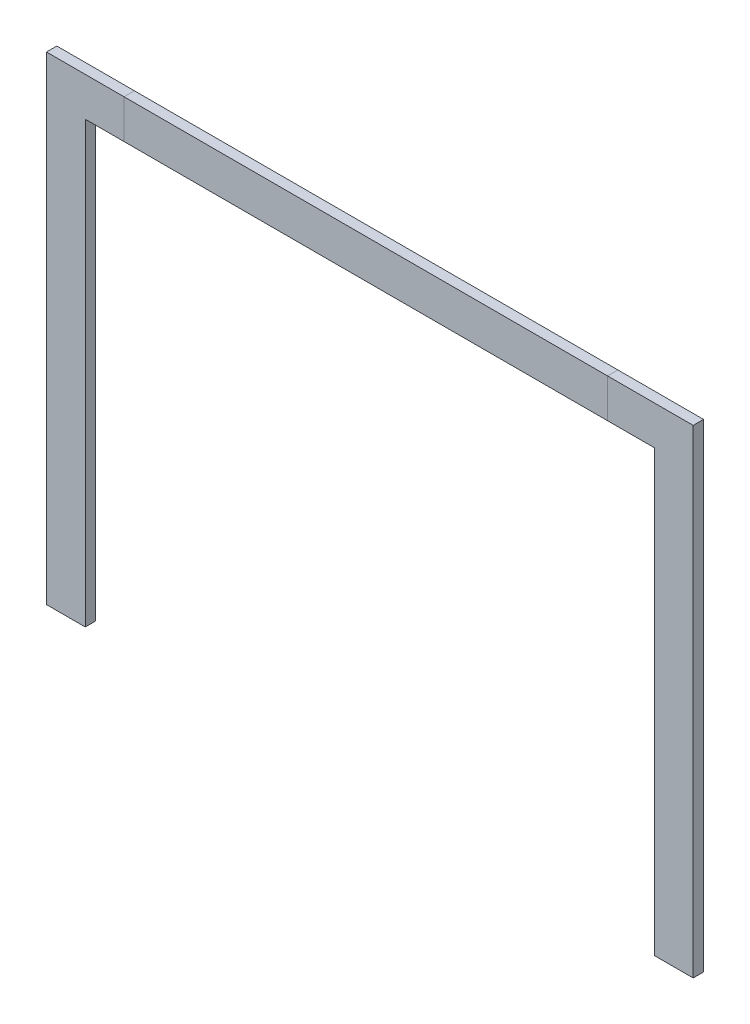
ISO-10303-21;
HEADER;
FILE_DESCRIPTION(('STEP AP214'),'2;1');
FILE_NAME('part.step','',(''),(''),'','','');
FILE_SCHEMA(('AUTOMOTIVE_DESIGN { 1 0 10303 214 1 1 1 1 }'));
ENDSEC;
DATA;
#1=APPLICATION_CONTEXT('core data for automotive mechanical design processes');
#2=APPLICATION_PROTOCOL_DEFINITION('international standard','automotive_design',2000,#1);
#3=PRODUCT_CONTEXT('',#1,'mechanical');
#4=PRODUCT('Part','Part','',(#3));
#5=PRODUCT_RELATED_PRODUCT_CATEGORY('part','',(#4));
#6=PRODUCT_DEFINITION_FORMATION('','',#4);
#7=PRODUCT_DEFINITION_CONTEXT('part definition',#1,'design');
#8=PRODUCT_DEFINITION('design','',#6,#7);
#9=PRODUCT_DEFINITION_SHAPE('','',#8);
#10=(LENGTH_UNIT() NAMED_UNIT(*) SI_UNIT(.MILLI.,.METRE.));
#11=(NAMED_UNIT(*) PLANE_ANGLE_UNIT() SI_UNIT($,.RADIAN.));
#12=(NAMED_UNIT(*) SI_UNIT($,.STERADIAN.) SOLID_ANGLE_UNIT());
#13=UNCERTAINTY_MEASURE_WITH_UNIT(LENGTH_MEASURE(1.E-05),#10,'distance_accuracy_value','');
#14=(GEOMETRIC_REPRESENTATION_CONTEXT(3) GLOBAL_UNCERTAINTY_ASSIGNED_CONTEXT((#13)) GLOBAL_UNIT_ASSIGNED_CONTEXT((#10,
#11,#12)) REPRESENTATION_CONTEXT('',''));
#15=CARTESIAN_POINT('',(0.,0.,0.));
#16=DIRECTION('',(0.,0.,1.));
#17=DIRECTION('',(1.,0.,0.));
#18=AXIS2_PLACEMENT_3D('',#15,#16,#17);
#19=CARTESIAN_POINT('',(-125.,-92.5,4.));
#20=DIRECTION('',(0.,1.,0.));
#21=DIRECTION('',(0.,0.,1.));
#22=AXIS2_PLACEMENT_3D('',#19,#20,#21);
#23=PLANE('',#22);
#24=DIRECTION('',(1.,0.,0.));
#25=VECTOR('',#24,1.);
#26=CARTESIAN_POINT('',(-125.,-92.5,0.));
#27=LINE('',#26,#25);
#28=CARTESIAN_POINT('',(-125.,-92.5,0.));
#29=VERTEX_POINT('',#28);
#30=CARTESIAN_POINT('',(-110.,-92.5,0.));
#31=VERTEX_POINT('',#30);
#32=EDGE_CURVE('E127',#29,#31,#27,.T.);
#33=ORIENTED_EDGE('',*,*,#32,.T.);
#34=DIRECTION('',(0.,0.,1.));
#35=VECTOR('',#34,1.);
#36=CARTESIAN_POINT('',(-110.,-92.5,0.));
#37=LINE('',#36,#35);
#38=CARTESIAN_POINT('',(-110.,-92.5,4.));
#39=VERTEX_POINT('',#38);
#40=EDGE_CURVE('E61',#31,#39,#37,.T.);
#41=ORIENTED_EDGE('',*,*,#40,.T.);
#42=DIRECTION('',(1.,0.,0.));
#43=VECTOR('',#42,1.);
#44=CARTESIAN_POINT('',(-125.,-92.5,4.));
#45=LINE('',#44,#43);
#46=CARTESIAN_POINT('',(-125.,-92.5,4.));
#47=VERTEX_POINT('',#46);
#48=EDGE_CURVE('E137',#47,#39,#45,.T.);
#49=ORIENTED_EDGE('',*,*,#48,.F.);
#50=DIRECTION('',(0.,0.,-1.));
#51=VECTOR('',#50,1.);
#52=CARTESIAN_POINT('',(-125.,-92.5,4.));
#53=LINE('',#52,#51);
#54=EDGE_CURVE('E131',#47,#29,#53,.T.);
#55=ORIENTED_EDGE('',*,*,#54,.T.);
#56=EDGE_LOOP('',(#33,#41,#49,#55));
#57=FACE_BOUND('',#56,.T.);
#58=ADVANCED_FACE('F44',(#57),#23,.F.);
#59=CARTESIAN_POINT('',(0.,0.,4.));
#60=DIRECTION('',(0.,0.,-1.));
#61=DIRECTION('',(-1.,0.,0.));
#62=AXIS2_PLACEMENT_3D('',#59,#60,#61);
#63=PLANE('',#62);
#64=ORIENTED_EDGE('',*,*,#48,.T.);
#65=DIRECTION('',(0.,-1.,0.));
#66=VECTOR('',#65,1.);
#67=CARTESIAN_POINT('',(-110.,-92.5,4.));
#68=LINE('',#67,#66);
#69=CARTESIAN_POINT('',(-110.,77.5,4.));
#70=VERTEX_POINT('',#69);
#71=EDGE_CURVE('E53',#70,#39,#68,.T.);
#72=ORIENTED_EDGE('',*,*,#71,.F.);
#73=DIRECTION('',(-1.,0.,0.));
#74=VECTOR('',#73,1.);
#75=CARTESIAN_POINT('',(-110.,77.5,4.));
#76=LINE('',#75,#74);
#77=CARTESIAN_POINT('',(-95.,77.5,4.));
#78=VERTEX_POINT('',#77);
#79=EDGE_CURVE('E48',#78,#70,#76,.T.);
#80=ORIENTED_EDGE('',*,*,#79,.F.);
#81=DIRECTION('',(0.,1.,0.));
#82=VECTOR('',#81,1.);
#83=CARTESIAN_POINT('',(-95.,0.,4.));
#84=LINE('',#83,#82);
#85=CARTESIAN_POINT('',(-95.,92.5,4.));
#86=VERTEX_POINT('',#85);
#87=EDGE_CURVE('E135',#78,#86,#84,.T.);
#88=ORIENTED_EDGE('',*,*,#87,.T.);
#89=DIRECTION('',(-1.,0.,0.));
#90=VECTOR('',#89,1.);
#91=CARTESIAN_POINT('',(-125.,92.5,4.));
#92=LINE('',#91,#90);
#93=CARTESIAN_POINT('',(-125.,92.5,4.));
#94=VERTEX_POINT('',#93);
#95=EDGE_CURVE('E134',#86,#94,#92,.T.);
#96=ORIENTED_EDGE('',*,*,#95,.T.);
#97=DIRECTION('',(0.,-1.,0.));
#98=VECTOR('',#97,1.);
#99=CARTESIAN_POINT('',(-125.,-92.5,4.));
#100=LINE('',#99,#98);
#101=EDGE_CURVE('E121',#94,#47,#100,.T.);
#102=ORIENTED_EDGE('',*,*,#101,.T.);
#103=EDGE_LOOP('',(#64,#72,#80,#88,#96,#102));
#104=FACE_BOUND('',#103,.T.);
#105=ADVANCED_FACE('F151',(#104),#63,.F.);
#106=CARTESIAN_POINT('',(0.,0.,0.));
#107=DIRECTION('',(0.,0.,-1.));
#108=DIRECTION('',(-1.,0.,0.));
#109=AXIS2_PLACEMENT_3D('',#106,#107,#108);
#110=PLANE('',#109);
#111=DIRECTION('',(0.,-1.,0.));
#112=VECTOR('',#111,1.);
#113=CARTESIAN_POINT('',(-110.,-92.5,0.));
#114=LINE('',#113,#112);
#115=CARTESIAN_POINT('',(-110.,77.5,0.));
#116=VERTEX_POINT('',#115);
#117=EDGE_CURVE('E133',#116,#31,#114,.T.);
#118=ORIENTED_EDGE('',*,*,#117,.T.);
#119=ORIENTED_EDGE('',*,*,#32,.F.);
#120=DIRECTION('',(0.,-1.,0.));
#121=VECTOR('',#120,1.);
#122=CARTESIAN_POINT('',(-125.,-92.5,0.));
#123=LINE('',#122,#121);
#124=CARTESIAN_POINT('',(-125.,92.5,0.));
#125=VERTEX_POINT('',#124);
#126=EDGE_CURVE('E114',#125,#29,#123,.T.);
#127=ORIENTED_EDGE('',*,*,#126,.F.);
#128=DIRECTION('',(-1.,0.,0.));
#129=VECTOR('',#128,1.);
#130=CARTESIAN_POINT('',(-125.,92.5,0.));
#131=LINE('',#130,#129);
#132=CARTESIAN_POINT('',(-95.,92.5,0.));
#133=VERTEX_POINT('',#132);
#134=EDGE_CURVE('E105',#133,#125,#131,.T.);
#135=ORIENTED_EDGE('',*,*,#134,.F.);
#136=DIRECTION('',(0.,1.,0.));
#137=VECTOR('',#136,1.);
#138=CARTESIAN_POINT('',(-95.,-92.5,0.));
#139=LINE('',#138,#137);
#140=CARTESIAN_POINT('',(-95.,77.5,0.));
#141=VERTEX_POINT('',#140);
#142=EDGE_CURVE('E86',#141,#133,#139,.T.);
#143=ORIENTED_EDGE('',*,*,#142,.F.);
#144=DIRECTION('',(-1.,0.,0.));
#145=VECTOR('',#144,1.);
#146=CARTESIAN_POINT('',(-110.,77.5,0.));
#147=LINE('',#146,#145);
#148=EDGE_CURVE('E115',#141,#116,#147,.T.);
#149=ORIENTED_EDGE('',*,*,#148,.T.);
#150=EDGE_LOOP('',(#118,#119,#127,#135,#143,#149));
#151=FACE_BOUND('',#150,.T.);
#152=ADVANCED_FACE('F125',(#151),#110,.T.);
#153=CARTESIAN_POINT('',(-125.,92.5,4.));
#154=DIRECTION('',(0.,-1.,0.));
#155=DIRECTION('',(0.,0.,-1.));
#156=AXIS2_PLACEMENT_3D('',#153,#154,#155);
#157=PLANE('',#156);
#158=ORIENTED_EDGE('',*,*,#95,.F.);
#159=DIRECTION('',(0.,0.,1.));
#160=VECTOR('',#159,1.);
#161=CARTESIAN_POINT('',(-95.,92.5,0.));
#162=LINE('',#161,#160);
#163=EDGE_CURVE('E111',#133,#86,#162,.T.);
#164=ORIENTED_EDGE('',*,*,#163,.F.);
#165=ORIENTED_EDGE('',*,*,#134,.T.);
#166=DIRECTION('',(0.,0.,-1.));
#167=VECTOR('',#166,1.);
#168=CARTESIAN_POINT('',(-125.,92.5,4.));
#169=LINE('',#168,#167);
#170=EDGE_CURVE('E109',#94,#125,#169,.T.);
#171=ORIENTED_EDGE('',*,*,#170,.F.);
#172=EDGE_LOOP('',(#158,#164,#165,#171));
#173=FACE_BOUND('',#172,.T.);
#174=ADVANCED_FACE('F108',(#173),#157,.F.);
#175=CARTESIAN_POINT('',(-125.,-92.5,4.));
#176=DIRECTION('',(1.,0.,0.));
#177=DIRECTION('',(0.,0.,-1.));
#178=AXIS2_PLACEMENT_3D('',#175,#176,#177);
#179=PLANE('',#178);
#180=ORIENTED_EDGE('',*,*,#126,.T.);
#181=ORIENTED_EDGE('',*,*,#54,.F.);
#182=ORIENTED_EDGE('',*,*,#101,.F.);
#183=ORIENTED_EDGE('',*,*,#170,.T.);
#184=EDGE_LOOP('',(#180,#181,#182,#183));
#185=FACE_BOUND('',#184,.T.);
#186=ADVANCED_FACE('F118',(#185),#179,.F.);
#187=CARTESIAN_POINT('',(-95.,-92.5,10.));
#188=DIRECTION('',(-1.,0.,0.));
#189=DIRECTION('',(0.,0.,1.));
#190=AXIS2_PLACEMENT_3D('',#187,#188,#189);
#191=PLANE('',#190);
#192=ORIENTED_EDGE('',*,*,#87,.F.);
#193=DIRECTION('',(0.,0.,-1.));
#194=VECTOR('',#193,1.);
#195=CARTESIAN_POINT('',(-95.,77.5,10.));
#196=LINE('',#195,#194);
#197=EDGE_CURVE('E122',#78,#141,#196,.T.);
#198=ORIENTED_EDGE('',*,*,#197,.T.);
#199=ORIENTED_EDGE('',*,*,#142,.T.);
#200=ORIENTED_EDGE('',*,*,#163,.T.);
#201=EDGE_LOOP('',(#192,#198,#199,#200));
#202=FACE_BOUND('',#201,.T.);
#203=ADVANCED_FACE('F149',(#202),#191,.F.);
#204=CARTESIAN_POINT('',(-110.,77.5,0.));
#205=DIRECTION('',(0.,1.,0.));
#206=DIRECTION('',(0.,0.,1.));
#207=AXIS2_PLACEMENT_3D('',#204,#205,#206);
#208=PLANE('',#207);
#209=ORIENTED_EDGE('',*,*,#79,.T.);
#210=DIRECTION('',(0.,0.,1.));
#211=VECTOR('',#210,1.);
#212=CARTESIAN_POINT('',(-110.,77.5,0.));
#213=LINE('',#212,#211);
#214=EDGE_CURVE('E12',#116,#70,#213,.T.);
#215=ORIENTED_EDGE('',*,*,#214,.F.);
#216=ORIENTED_EDGE('',*,*,#148,.F.);
#217=ORIENTED_EDGE('',*,*,#197,.F.);
#218=EDGE_LOOP('',(#209,#215,#216,#217));
#219=FACE_BOUND('',#218,.T.);
#220=ADVANCED_FACE('F46',(#219),#208,.F.);
#221=CARTESIAN_POINT('',(-110.,-92.5,0.));
#222=DIRECTION('',(-1.,0.,0.));
#223=DIRECTION('',(0.,0.,1.));
#224=AXIS2_PLACEMENT_3D('',#221,#222,#223);
#225=PLANE('',#224);
#226=ORIENTED_EDGE('',*,*,#71,.T.);
#227=ORIENTED_EDGE('',*,*,#40,.F.);
#228=ORIENTED_EDGE('',*,*,#117,.F.);
#229=ORIENTED_EDGE('',*,*,#214,.T.);
#230=EDGE_LOOP('',(#226,#227,#228,#229));
#231=FACE_BOUND('',#230,.T.);
#232=ADVANCED_FACE('F165',(#231),#225,.F.);
#233=CLOSED_SHELL('',(#58,#105,#152,#174,#186,#203,#220,#232));
#234=MANIFOLD_SOLID_BREP('B2',#233);
#235=CARTESIAN_POINT('',(-95.,62.5,0.));
#236=DIRECTION('',(-1.,0.,0.));
#237=DIRECTION('',(0.,0.,1.));
#238=AXIS2_PLACEMENT_3D('',#235,#236,#237);
#239=PLANE('',#238);
#240=DIRECTION('',(0.,0.,1.));
#241=VECTOR('',#240,1.);
#242=CARTESIAN_POINT('',(-95.,77.5,0.));
#243=LINE('',#242,#241);
#244=CARTESIAN_POINT('',(-95.,77.5,0.));
#245=VERTEX_POINT('',#244);
#246=CARTESIAN_POINT('',(-95.,77.5,4.));
#247=VERTEX_POINT('',#246);
#248=EDGE_CURVE('E286',#245,#247,#243,.T.);
#249=ORIENTED_EDGE('',*,*,#248,.T.);
#250=DIRECTION('',(0.,-1.,0.));
#251=VECTOR('',#250,1.);
#252=CARTESIAN_POINT('',(-95.,62.5,4.));
#253=LINE('',#252,#251);
#254=CARTESIAN_POINT('',(-95.,92.5,4.));
#255=VERTEX_POINT('',#254);
#256=EDGE_CURVE('E283',#255,#247,#253,.T.);
#257=ORIENTED_EDGE('',*,*,#256,.F.);
#258=DIRECTION('',(0.,0.,1.));
#259=VECTOR('',#258,1.);
#260=CARTESIAN_POINT('',(-95.,92.5,0.));
#261=LINE('',#260,#259);
#262=CARTESIAN_POINT('',(-95.,92.5,0.));
#263=VERTEX_POINT('',#262);
#264=EDGE_CURVE('E42',#263,#255,#261,.T.);
#265=ORIENTED_EDGE('',*,*,#264,.F.);
#266=DIRECTION('',(0.,-1.,0.));
#267=VECTOR('',#266,1.);
#268=CARTESIAN_POINT('',(-95.,62.5,0.));
#269=LINE('',#268,#267);
#270=EDGE_CURVE('E293',#263,#245,#269,.T.);
#271=ORIENTED_EDGE('',*,*,#270,.T.);
#272=EDGE_LOOP('',(#249,#257,#265,#271));
#273=FACE_BOUND('',#272,.T.);
#274=ADVANCED_FACE('F241',(#273),#239,.T.);
#275=CARTESIAN_POINT('',(-95.,92.5,0.));
#276=DIRECTION('',(0.,1.,0.));
#277=DIRECTION('',(0.,0.,1.));
#278=AXIS2_PLACEMENT_3D('',#275,#276,#277);
#279=PLANE('',#278);
#280=DIRECTION('',(-1.,0.,0.));
#281=VECTOR('',#280,1.);
#282=CARTESIAN_POINT('',(-95.,92.5,4.));
#283=LINE('',#282,#281);
#284=CARTESIAN_POINT('',(91.8877270781677,92.5,4.));
#285=VERTEX_POINT('',#284);
#286=EDGE_CURVE('E278',#285,#255,#283,.T.);
#287=ORIENTED_EDGE('',*,*,#286,.F.);
#288=DIRECTION('',(0.,0.,1.));
#289=VECTOR('',#288,1.);
#290=CARTESIAN_POINT('',(91.8877270781677,92.5,0.));
#291=LINE('',#290,#289);
#292=CARTESIAN_POINT('',(91.8877270781677,92.5,0.));
#293=VERTEX_POINT('',#292);
#294=EDGE_CURVE('E244',#293,#285,#291,.T.);
#295=ORIENTED_EDGE('',*,*,#294,.F.);
#296=DIRECTION('',(-1.,0.,0.));
#297=VECTOR('',#296,1.);
#298=CARTESIAN_POINT('',(-95.,92.5,0.));
#299=LINE('',#298,#297);
#300=EDGE_CURVE('E280',#293,#263,#299,.T.);
#301=ORIENTED_EDGE('',*,*,#300,.T.);
#302=ORIENTED_EDGE('',*,*,#264,.T.);
#303=EDGE_LOOP('',(#287,#295,#301,#302));
#304=FACE_BOUND('',#303,.T.);
#305=ADVANCED_FACE('F275',(#304),#279,.T.);
#306=CARTESIAN_POINT('',(91.8877270781677,62.5,0.));
#307=DIRECTION('',(1.,0.,0.));
#308=DIRECTION('',(0.,0.,-1.));
#309=AXIS2_PLACEMENT_3D('',#306,#307,#308);
#310=PLANE('',#309);
#311=DIRECTION('',(0.,0.,1.));
#312=VECTOR('',#311,1.);
#313=CARTESIAN_POINT('',(91.8877270781677,77.5,0.));
#314=LINE('',#313,#312);
#315=CARTESIAN_POINT('',(91.8877270781677,77.5,0.));
#316=VERTEX_POINT('',#315);
#317=CARTESIAN_POINT('',(91.8877270781677,77.5,4.));
#318=VERTEX_POINT('',#317);
#319=EDGE_CURVE('E255',#316,#318,#314,.T.);
#320=ORIENTED_EDGE('',*,*,#319,.F.);
#321=DIRECTION('',(0.,1.,0.));
#322=VECTOR('',#321,1.);
#323=CARTESIAN_POINT('',(91.8877270781677,62.5,0.));
#324=LINE('',#323,#322);
#325=EDGE_CURVE('E295',#316,#293,#324,.T.);
#326=ORIENTED_EDGE('',*,*,#325,.T.);
#327=ORIENTED_EDGE('',*,*,#294,.T.);
#328=DIRECTION('',(0.,1.,0.));
#329=VECTOR('',#328,1.);
#330=CARTESIAN_POINT('',(91.8877270781677,62.5,4.));
#331=LINE('',#330,#329);
#332=EDGE_CURVE('E288',#318,#285,#331,.T.);
#333=ORIENTED_EDGE('',*,*,#332,.F.);
#334=EDGE_LOOP('',(#320,#326,#327,#333));
#335=FACE_BOUND('',#334,.T.);
#336=ADVANCED_FACE('F315',(#335),#310,.T.);
#337=CARTESIAN_POINT('',(0.,0.,0.));
#338=DIRECTION('',(0.,0.,-1.));
#339=DIRECTION('',(-1.,0.,0.));
#340=AXIS2_PLACEMENT_3D('',#337,#338,#339);
#341=PLANE('',#340);
#342=DIRECTION('',(-1.,0.,0.));
#343=VECTOR('',#342,1.);
#344=CARTESIAN_POINT('',(-95.,77.5,0.));
#345=LINE('',#344,#343);
#346=EDGE_CURVE('E302',#316,#245,#345,.T.);
#347=ORIENTED_EDGE('',*,*,#346,.T.);
#348=ORIENTED_EDGE('',*,*,#270,.F.);
#349=ORIENTED_EDGE('',*,*,#300,.F.);
#350=ORIENTED_EDGE('',*,*,#325,.F.);
#351=EDGE_LOOP('',(#347,#348,#349,#350));
#352=FACE_BOUND('',#351,.T.);
#353=ADVANCED_FACE('F309',(#352),#341,.T.);
#354=CARTESIAN_POINT('',(0.,0.,4.));
#355=DIRECTION('',(0.,0.,-1.));
#356=DIRECTION('',(-1.,0.,0.));
#357=AXIS2_PLACEMENT_3D('',#354,#355,#356);
#358=PLANE('',#357);
#359=ORIENTED_EDGE('',*,*,#256,.T.);
#360=DIRECTION('',(-1.,0.,0.));
#361=VECTOR('',#360,1.);
#362=CARTESIAN_POINT('',(-95.,77.5,4.));
#363=LINE('',#362,#361);
#364=EDGE_CURVE('E304',#318,#247,#363,.T.);
#365=ORIENTED_EDGE('',*,*,#364,.F.);
#366=ORIENTED_EDGE('',*,*,#332,.T.);
#367=ORIENTED_EDGE('',*,*,#286,.T.);
#368=EDGE_LOOP('',(#359,#365,#366,#367));
#369=FACE_BOUND('',#368,.T.);
#370=ADVANCED_FACE('F290',(#369),#358,.F.);
#371=CARTESIAN_POINT('',(-95.,77.5,0.));
#372=DIRECTION('',(0.,1.,0.));
#373=DIRECTION('',(0.,0.,1.));
#374=AXIS2_PLACEMENT_3D('',#371,#372,#373);
#375=PLANE('',#374);
#376=ORIENTED_EDGE('',*,*,#364,.T.);
#377=ORIENTED_EDGE('',*,*,#248,.F.);
#378=ORIENTED_EDGE('',*,*,#346,.F.);
#379=ORIENTED_EDGE('',*,*,#319,.T.);
#380=EDGE_LOOP('',(#376,#377,#378,#379));
#381=FACE_BOUND('',#380,.T.);
#382=ADVANCED_FACE('F312',(#381),#375,.F.);
#383=CLOSED_SHELL('',(#274,#305,#336,#353,#370,#382));
#384=MANIFOLD_SOLID_BREP('B6',#383);
#385=CARTESIAN_POINT('',(125.,-92.5,4.));
#386=DIRECTION('',(-1.,0.,0.));
#387=DIRECTION('',(0.,0.,1.));
#388=AXIS2_PLACEMENT_3D('',#385,#386,#387);
#389=PLANE('',#388);
#390=DIRECTION('',(0.,1.,0.));
#391=VECTOR('',#390,1.);
#392=CARTESIAN_POINT('',(125.,-92.5,0.));
#393=LINE('',#392,#391);
#394=CARTESIAN_POINT('',(125.,-92.5,0.));
#395=VERTEX_POINT('',#394);
#396=CARTESIAN_POINT('',(125.,92.5,0.));
#397=VERTEX_POINT('',#396);
#398=EDGE_CURVE('E418',#395,#397,#393,.T.);
#399=ORIENTED_EDGE('',*,*,#398,.T.);
#400=DIRECTION('',(0.,0.,-1.));
#401=VECTOR('',#400,1.);
#402=CARTESIAN_POINT('',(125.,92.5,4.));
#403=LINE('',#402,#401);
#404=CARTESIAN_POINT('',(125.,92.5,4.));
#405=VERTEX_POINT('',#404);
#406=EDGE_CURVE('E372',#405,#397,#403,.T.);
#407=ORIENTED_EDGE('',*,*,#406,.F.);
#408=DIRECTION('',(0.,1.,0.));
#409=VECTOR('',#408,1.);
#410=CARTESIAN_POINT('',(125.,-92.5,4.));
#411=LINE('',#410,#409);
#412=CARTESIAN_POINT('',(125.,-92.5,4.));
#413=VERTEX_POINT('',#412);
#414=EDGE_CURVE('E412',#413,#405,#411,.T.);
#415=ORIENTED_EDGE('',*,*,#414,.F.);
#416=DIRECTION('',(0.,0.,-1.));
#417=VECTOR('',#416,1.);
#418=CARTESIAN_POINT('',(125.,-92.5,4.));
#419=LINE('',#418,#417);
#420=EDGE_CURVE('E404',#413,#395,#419,.T.);
#421=ORIENTED_EDGE('',*,*,#420,.T.);
#422=EDGE_LOOP('',(#399,#407,#415,#421));
#423=FACE_BOUND('',#422,.T.);
#424=ADVANCED_FACE('F365',(#423),#389,.F.);
#425=CARTESIAN_POINT('',(-125.,92.5,4.));
#426=DIRECTION('',(0.,-1.,0.));
#427=DIRECTION('',(0.,0.,-1.));
#428=AXIS2_PLACEMENT_3D('',#425,#426,#427);
#429=PLANE('',#428);
#430=DIRECTION('',(-1.,0.,0.));
#431=VECTOR('',#430,1.);
#432=CARTESIAN_POINT('',(-125.,92.5,0.));
#433=LINE('',#432,#431);
#434=CARTESIAN_POINT('',(91.8877270781677,92.5,0.));
#435=VERTEX_POINT('',#434);
#436=EDGE_CURVE('E413',#397,#435,#433,.T.);
#437=ORIENTED_EDGE('',*,*,#436,.T.);
#438=DIRECTION('',(0.,0.,1.));
#439=VECTOR('',#438,1.);
#440=CARTESIAN_POINT('',(91.8877270781677,92.5,0.));
#441=LINE('',#440,#439);
#442=CARTESIAN_POINT('',(91.8877270781677,92.5,4.));
#443=VERTEX_POINT('',#442);
#444=EDGE_CURVE('E440',#435,#443,#441,.T.);
#445=ORIENTED_EDGE('',*,*,#444,.T.);
#446=DIRECTION('',(-1.,0.,0.));
#447=VECTOR('',#446,1.);
#448=CARTESIAN_POINT('',(-125.,92.5,4.));
#449=LINE('',#448,#447);
#450=EDGE_CURVE('E437',#405,#443,#449,.T.);
#451=ORIENTED_EDGE('',*,*,#450,.F.);
#452=ORIENTED_EDGE('',*,*,#406,.T.);
#453=EDGE_LOOP('',(#437,#445,#451,#452));
#454=FACE_BOUND('',#453,.T.);
#455=ADVANCED_FACE('F434',(#454),#429,.F.);
#456=CARTESIAN_POINT('',(91.8877270781677,60.,10.));
#457=DIRECTION('',(1.,0.,0.));
#458=DIRECTION('',(0.,0.,-1.));
#459=AXIS2_PLACEMENT_3D('',#456,#457,#458);
#460=PLANE('',#459);
#461=DIRECTION('',(0.,-1.,0.));
#462=VECTOR('',#461,1.);
#463=CARTESIAN_POINT('',(91.8877270781677,60.,0.));
#464=LINE('',#463,#462);
#465=CARTESIAN_POINT('',(91.8877270781677,77.5,0.));
#466=VERTEX_POINT('',#465);
#467=EDGE_CURVE('E429',#435,#466,#464,.T.);
#468=ORIENTED_EDGE('',*,*,#467,.T.);
#469=DIRECTION('',(0.,0.,1.));
#470=VECTOR('',#469,1.);
#471=CARTESIAN_POINT('',(91.8877270781677,77.5,10.));
#472=LINE('',#471,#470);
#473=CARTESIAN_POINT('',(91.8877270781677,77.5,4.));
#474=VERTEX_POINT('',#473);
#475=EDGE_CURVE('E239',#466,#474,#472,.T.);
#476=ORIENTED_EDGE('',*,*,#475,.T.);
#477=DIRECTION('',(0.,-1.,0.));
#478=VECTOR('',#477,1.);
#479=CARTESIAN_POINT('',(91.8877270781677,0.,4.));
#480=LINE('',#479,#478);
#481=EDGE_CURVE('E425',#443,#474,#480,.T.);
#482=ORIENTED_EDGE('',*,*,#481,.F.);
#483=ORIENTED_EDGE('',*,*,#444,.F.);
#484=EDGE_LOOP('',(#468,#476,#482,#483));
#485=FACE_BOUND('',#484,.T.);
#486=ADVANCED_FACE('F474',(#485),#460,.F.);
#487=CARTESIAN_POINT('',(0.,0.,0.));
#488=DIRECTION('',(0.,0.,-1.));
#489=DIRECTION('',(-1.,0.,0.));
#490=AXIS2_PLACEMENT_3D('',#487,#488,#489);
#491=PLANE('',#490);
#492=DIRECTION('',(-1.,0.,0.));
#493=VECTOR('',#492,1.);
#494=CARTESIAN_POINT('',(-110.,77.5,0.));
#495=LINE('',#494,#493);
#496=CARTESIAN_POINT('',(110.,77.5,0.));
#497=VERTEX_POINT('',#496);
#498=EDGE_CURVE('E449',#497,#466,#495,.T.);
#499=ORIENTED_EDGE('',*,*,#498,.T.);
#500=ORIENTED_EDGE('',*,*,#467,.F.);
#501=ORIENTED_EDGE('',*,*,#436,.F.);
#502=ORIENTED_EDGE('',*,*,#398,.F.);
#503=DIRECTION('',(1.,0.,0.));
#504=VECTOR('',#503,1.);
#505=CARTESIAN_POINT('',(-125.,-92.5,0.));
#506=LINE('',#505,#504);
#507=CARTESIAN_POINT('',(110.,-92.5,0.));
#508=VERTEX_POINT('',#507);
#509=EDGE_CURVE('E401',#508,#395,#506,.T.);
#510=ORIENTED_EDGE('',*,*,#509,.F.);
#511=DIRECTION('',(0.,1.,0.));
#512=VECTOR('',#511,1.);
#513=CARTESIAN_POINT('',(110.,-92.5,0.));
#514=LINE('',#513,#512);
#515=EDGE_CURVE('E452',#508,#497,#514,.T.);
#516=ORIENTED_EDGE('',*,*,#515,.T.);
#517=EDGE_LOOP('',(#499,#500,#501,#502,#510,#516));
#518=FACE_BOUND('',#517,.T.);
#519=ADVANCED_FACE('F421',(#518),#491,.T.);
#520=CARTESIAN_POINT('',(0.,0.,4.));
#521=DIRECTION('',(0.,0.,-1.));
#522=DIRECTION('',(-1.,0.,0.));
#523=AXIS2_PLACEMENT_3D('',#520,#521,#522);
#524=PLANE('',#523);
#525=ORIENTED_EDGE('',*,*,#481,.T.);
#526=DIRECTION('',(-1.,0.,0.));
#527=VECTOR('',#526,1.);
#528=CARTESIAN_POINT('',(-110.,77.5,4.));
#529=LINE('',#528,#527);
#530=CARTESIAN_POINT('',(110.,77.5,4.));
#531=VERTEX_POINT('',#530);
#532=EDGE_CURVE('E379',#531,#474,#529,.T.);
#533=ORIENTED_EDGE('',*,*,#532,.F.);
#534=DIRECTION('',(0.,1.,0.));
#535=VECTOR('',#534,1.);
#536=CARTESIAN_POINT('',(110.,-92.5,4.));
#537=LINE('',#536,#535);
#538=CARTESIAN_POINT('',(110.,-92.5,4.));
#539=VERTEX_POINT('',#538);
#540=EDGE_CURVE('E453',#539,#531,#537,.T.);
#541=ORIENTED_EDGE('',*,*,#540,.F.);
#542=DIRECTION('',(1.,0.,0.));
#543=VECTOR('',#542,1.);
#544=CARTESIAN_POINT('',(-125.,-92.5,4.));
#545=LINE('',#544,#543);
#546=EDGE_CURVE('E387',#539,#413,#545,.T.);
#547=ORIENTED_EDGE('',*,*,#546,.T.);
#548=ORIENTED_EDGE('',*,*,#414,.T.);
#549=ORIENTED_EDGE('',*,*,#450,.T.);
#550=EDGE_LOOP('',(#525,#533,#541,#547,#548,#549));
#551=FACE_BOUND('',#550,.T.);
#552=ADVANCED_FACE('F441',(#551),#524,.F.);
#553=CARTESIAN_POINT('',(-125.,-92.5,4.));
#554=DIRECTION('',(0.,1.,0.));
#555=DIRECTION('',(0.,0.,1.));
#556=AXIS2_PLACEMENT_3D('',#553,#554,#555);
#557=PLANE('',#556);
#558=ORIENTED_EDGE('',*,*,#546,.F.);
#559=DIRECTION('',(0.,0.,1.));
#560=VECTOR('',#559,1.);
#561=CARTESIAN_POINT('',(110.,-92.5,0.));
#562=LINE('',#561,#560);
#563=EDGE_CURVE('E408',#508,#539,#562,.T.);
#564=ORIENTED_EDGE('',*,*,#563,.F.);
#565=ORIENTED_EDGE('',*,*,#509,.T.);
#566=ORIENTED_EDGE('',*,*,#420,.F.);
#567=EDGE_LOOP('',(#558,#564,#565,#566));
#568=FACE_BOUND('',#567,.T.);
#569=ADVANCED_FACE('F403',(#568),#557,.F.);
#570=CARTESIAN_POINT('',(-110.,77.5,0.));
#571=DIRECTION('',(0.,1.,0.));
#572=DIRECTION('',(0.,0.,1.));
#573=AXIS2_PLACEMENT_3D('',#570,#571,#572);
#574=PLANE('',#573);
#575=ORIENTED_EDGE('',*,*,#498,.F.);
#576=DIRECTION('',(0.,0.,1.));
#577=VECTOR('',#576,1.);
#578=CARTESIAN_POINT('',(110.,77.5,0.));
#579=LINE('',#578,#577);
#580=EDGE_CURVE('E447',#497,#531,#579,.T.);
#581=ORIENTED_EDGE('',*,*,#580,.T.);
#582=ORIENTED_EDGE('',*,*,#532,.T.);
#583=ORIENTED_EDGE('',*,*,#475,.F.);
#584=EDGE_LOOP('',(#575,#581,#582,#583));
#585=FACE_BOUND('',#584,.T.);
#586=ADVANCED_FACE('F475',(#585),#574,.F.);
#587=CARTESIAN_POINT('',(110.,-92.5,0.));
#588=DIRECTION('',(1.,0.,0.));
#589=DIRECTION('',(0.,0.,-1.));
#590=AXIS2_PLACEMENT_3D('',#587,#588,#589);
#591=PLANE('',#590);
#592=ORIENTED_EDGE('',*,*,#540,.T.);
#593=ORIENTED_EDGE('',*,*,#580,.F.);
#594=ORIENTED_EDGE('',*,*,#515,.F.);
#595=ORIENTED_EDGE('',*,*,#563,.T.);
#596=EDGE_LOOP('',(#592,#593,#594,#595));
#597=FACE_BOUND('',#596,.T.);
#598=ADVANCED_FACE('F464',(#597),#591,.F.);
#599=CLOSED_SHELL('',(#424,#455,#486,#519,#552,#569,#586,#598));
#600=MANIFOLD_SOLID_BREP('B36',#599);
#601=ADVANCED_BREP_SHAPE_REPRESENTATION('',(#18,#234,#384,#600),#14);
#602=SHAPE_DEFINITION_REPRESENTATION(#9,#601);
ENDSEC;
END-ISO-10303-21;
